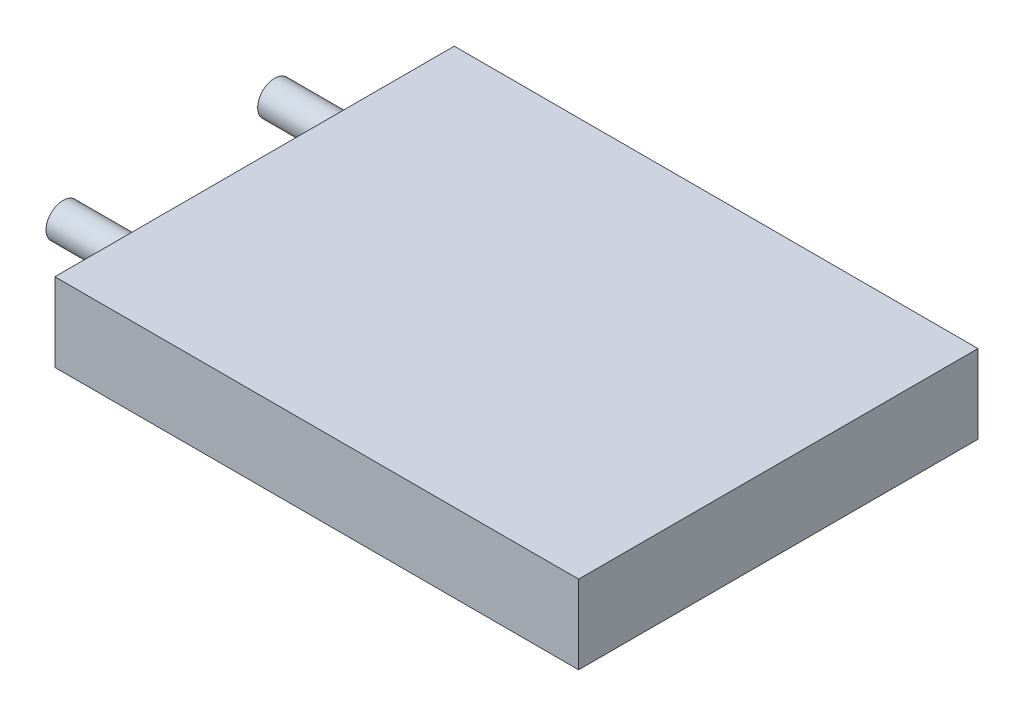
ISO-10303-21;
HEADER;
FILE_DESCRIPTION(('STEP AP214'),'2;1');
FILE_NAME('part.step','',(''),(''),'','','');
FILE_SCHEMA(('AUTOMOTIVE_DESIGN { 1 0 10303 214 1 1 1 1 }'));
ENDSEC;
DATA;
#1=APPLICATION_CONTEXT('core data for automotive mechanical design processes');
#2=APPLICATION_PROTOCOL_DEFINITION('international standard','automotive_design',2000,#1);
#3=PRODUCT_CONTEXT('',#1,'mechanical');
#4=PRODUCT('Part','Part','',(#3));
#5=PRODUCT_RELATED_PRODUCT_CATEGORY('part','',(#4));
#6=PRODUCT_DEFINITION_FORMATION('','',#4);
#7=PRODUCT_DEFINITION_CONTEXT('part definition',#1,'design');
#8=PRODUCT_DEFINITION('design','',#6,#7);
#9=PRODUCT_DEFINITION_SHAPE('','',#8);
#10=(LENGTH_UNIT() NAMED_UNIT(*) SI_UNIT(.MILLI.,.METRE.));
#11=(NAMED_UNIT(*) PLANE_ANGLE_UNIT() SI_UNIT($,.RADIAN.));
#12=(NAMED_UNIT(*) SI_UNIT($,.STERADIAN.) SOLID_ANGLE_UNIT());
#13=UNCERTAINTY_MEASURE_WITH_UNIT(LENGTH_MEASURE(1.E-05),#10,'distance_accuracy_value','');
#14=(GEOMETRIC_REPRESENTATION_CONTEXT(3) GLOBAL_UNCERTAINTY_ASSIGNED_CONTEXT((#13)) GLOBAL_UNIT_ASSIGNED_CONTEXT((#10,
#11,#12)) REPRESENTATION_CONTEXT('',''));
#15=CARTESIAN_POINT('',(0.,0.,0.));
#16=DIRECTION('',(0.,0.,1.));
#17=DIRECTION('',(1.,0.,0.));
#18=AXIS2_PLACEMENT_3D('',#15,#16,#17);
#19=CARTESIAN_POINT('',(40.,12.,-30.5));
#20=DIRECTION('',(-1.,0.,0.));
#21=DIRECTION('',(0.,0.,1.));
#22=AXIS2_PLACEMENT_3D('',#19,#20,#21);
#23=PLANE('',#22);
#24=DIRECTION('',(0.,0.,-1.));
#25=VECTOR('',#24,1.);
#26=CARTESIAN_POINT('',(40.,0.,-30.5));
#27=LINE('',#26,#25);
#28=CARTESIAN_POINT('',(40.,0.,30.5));
#29=VERTEX_POINT('',#28);
#30=CARTESIAN_POINT('',(40.,0.,-30.5));
#31=VERTEX_POINT('',#30);
#32=EDGE_CURVE('E106',#29,#31,#27,.T.);
#33=ORIENTED_EDGE('',*,*,#32,.T.);
#34=DIRECTION('',(0.,-1.,0.));
#35=VECTOR('',#34,1.);
#36=CARTESIAN_POINT('',(40.,12.,-30.5));
#37=LINE('',#36,#35);
#38=CARTESIAN_POINT('',(40.,12.,-30.5));
#39=VERTEX_POINT('',#38);
#40=EDGE_CURVE('E97',#39,#31,#37,.T.);
#41=ORIENTED_EDGE('',*,*,#40,.F.);
#42=DIRECTION('',(0.,0.,-1.));
#43=VECTOR('',#42,1.);
#44=CARTESIAN_POINT('',(40.,12.,-30.5));
#45=LINE('',#44,#43);
#46=CARTESIAN_POINT('',(40.,12.,30.5));
#47=VERTEX_POINT('',#46);
#48=EDGE_CURVE('E91',#47,#39,#45,.T.);
#49=ORIENTED_EDGE('',*,*,#48,.F.);
#50=DIRECTION('',(0.,-1.,0.));
#51=VECTOR('',#50,1.);
#52=CARTESIAN_POINT('',(40.,12.,30.5));
#53=LINE('',#52,#51);
#54=EDGE_CURVE('E102',#47,#29,#53,.T.);
#55=ORIENTED_EDGE('',*,*,#54,.T.);
#56=EDGE_LOOP('',(#33,#41,#49,#55));
#57=FACE_BOUND('',#56,.T.);
#58=ADVANCED_FACE('F39',(#57),#23,.F.);
#59=CARTESIAN_POINT('',(-40.,12.,-30.5));
#60=DIRECTION('',(0.,0.,1.));
#61=DIRECTION('',(1.,0.,0.));
#62=AXIS2_PLACEMENT_3D('',#59,#60,#61);
#63=PLANE('',#62);
#64=DIRECTION('',(-1.,0.,0.));
#65=VECTOR('',#64,1.);
#66=CARTESIAN_POINT('',(-40.,0.,-30.5));
#67=LINE('',#66,#65);
#68=CARTESIAN_POINT('',(-40.,0.,-30.5));
#69=VERTEX_POINT('',#68);
#70=EDGE_CURVE('E96',#31,#69,#67,.T.);
#71=ORIENTED_EDGE('',*,*,#70,.T.);
#72=DIRECTION('',(0.,-1.,0.));
#73=VECTOR('',#72,1.);
#74=CARTESIAN_POINT('',(-40.,12.,-30.5));
#75=LINE('',#74,#73);
#76=CARTESIAN_POINT('',(-40.,12.,-30.5));
#77=VERTEX_POINT('',#76);
#78=EDGE_CURVE('E94',#77,#69,#75,.T.);
#79=ORIENTED_EDGE('',*,*,#78,.F.);
#80=DIRECTION('',(-1.,0.,0.));
#81=VECTOR('',#80,1.);
#82=CARTESIAN_POINT('',(-40.,12.,-30.5));
#83=LINE('',#82,#81);
#84=EDGE_CURVE('E86',#39,#77,#83,.T.);
#85=ORIENTED_EDGE('',*,*,#84,.F.);
#86=ORIENTED_EDGE('',*,*,#40,.T.);
#87=EDGE_LOOP('',(#71,#79,#85,#86));
#88=FACE_BOUND('',#87,.T.);
#89=ADVANCED_FACE('F95',(#88),#63,.F.);
#90=CARTESIAN_POINT('',(-40.,12.,-30.5));
#91=DIRECTION('',(1.,0.,0.));
#92=DIRECTION('',(0.,0.,-1.));
#93=AXIS2_PLACEMENT_3D('',#90,#91,#92);
#94=PLANE('',#93);
#95=CARTESIAN_POINT('',(-40.,6.38490016907919,16.7645406976592));
#96=DIRECTION('',(1.,0.,0.));
#97=DIRECTION('',(0.,0.,-1.));
#98=AXIS2_PLACEMENT_3D('',#95,#96,#97);
#99=CIRCLE('',#98,2.59216136788073);
#100=CARTESIAN_POINT('',(-40.,6.38490016907919,14.1723793297785));
#101=VERTEX_POINT('',#100);
#102=EDGE_CURVE('E11',#101,#101,#99,.F.);
#103=ORIENTED_EDGE('',*,*,#102,.F.);
#104=EDGE_LOOP('',(#103));
#105=FACE_BOUND('',#104,.T.);
#106=CARTESIAN_POINT('',(-40.,6.38490016907919,-15.5670735049693));
#107=DIRECTION('',(1.,0.,0.));
#108=DIRECTION('',(0.,0.,-1.));
#109=AXIS2_PLACEMENT_3D('',#106,#107,#108);
#110=CIRCLE('',#109,2.59216136788073);
#111=CARTESIAN_POINT('',(-40.,6.38490016907919,-18.15923487285));
#112=VERTEX_POINT('',#111);
#113=EDGE_CURVE('E47',#112,#112,#110,.F.);
#114=ORIENTED_EDGE('',*,*,#113,.F.);
#115=EDGE_LOOP('',(#114));
#116=FACE_BOUND('',#115,.T.);
#117=DIRECTION('',(0.,0.,1.));
#118=VECTOR('',#117,1.);
#119=CARTESIAN_POINT('',(-40.,0.,-30.5));
#120=LINE('',#119,#118);
#121=CARTESIAN_POINT('',(-40.,0.,30.5));
#122=VERTEX_POINT('',#121);
#123=EDGE_CURVE('E72',#69,#122,#120,.T.);
#124=ORIENTED_EDGE('',*,*,#123,.T.);
#125=DIRECTION('',(0.,-1.,0.));
#126=VECTOR('',#125,1.);
#127=CARTESIAN_POINT('',(-40.,12.,30.5));
#128=LINE('',#127,#126);
#129=CARTESIAN_POINT('',(-40.,12.,30.5));
#130=VERTEX_POINT('',#129);
#131=EDGE_CURVE('E98',#130,#122,#128,.T.);
#132=ORIENTED_EDGE('',*,*,#131,.F.);
#133=DIRECTION('',(0.,0.,1.));
#134=VECTOR('',#133,1.);
#135=CARTESIAN_POINT('',(-40.,12.,-30.5));
#136=LINE('',#135,#134);
#137=EDGE_CURVE('E89',#77,#130,#136,.T.);
#138=ORIENTED_EDGE('',*,*,#137,.F.);
#139=ORIENTED_EDGE('',*,*,#78,.T.);
#140=EDGE_LOOP('',(#124,#132,#138,#139));
#141=FACE_BOUND('',#140,.T.);
#142=ADVANCED_FACE('F100',(#105,#116,#141),#94,.F.);
#143=CARTESIAN_POINT('',(-40.,12.,30.5));
#144=DIRECTION('',(0.,0.,-1.));
#145=DIRECTION('',(-1.,0.,0.));
#146=AXIS2_PLACEMENT_3D('',#143,#144,#145);
#147=PLANE('',#146);
#148=DIRECTION('',(1.,0.,0.));
#149=VECTOR('',#148,1.);
#150=CARTESIAN_POINT('',(-40.,0.,30.5));
#151=LINE('',#150,#149);
#152=EDGE_CURVE('E78',#122,#29,#151,.T.);
#153=ORIENTED_EDGE('',*,*,#152,.T.);
#154=ORIENTED_EDGE('',*,*,#54,.F.);
#155=DIRECTION('',(1.,0.,0.));
#156=VECTOR('',#155,1.);
#157=CARTESIAN_POINT('',(-40.,12.,30.5));
#158=LINE('',#157,#156);
#159=EDGE_CURVE('E55',#130,#47,#158,.T.);
#160=ORIENTED_EDGE('',*,*,#159,.F.);
#161=ORIENTED_EDGE('',*,*,#131,.T.);
#162=EDGE_LOOP('',(#153,#154,#160,#161));
#163=FACE_BOUND('',#162,.T.);
#164=ADVANCED_FACE('F121',(#163),#147,.F.);
#165=CARTESIAN_POINT('',(0.,12.,0.));
#166=DIRECTION('',(0.,1.,0.));
#167=DIRECTION('',(0.,0.,1.));
#168=AXIS2_PLACEMENT_3D('',#165,#166,#167);
#169=PLANE('',#168);
#170=ORIENTED_EDGE('',*,*,#48,.T.);
#171=ORIENTED_EDGE('',*,*,#84,.T.);
#172=ORIENTED_EDGE('',*,*,#137,.T.);
#173=ORIENTED_EDGE('',*,*,#159,.T.);
#174=EDGE_LOOP('',(#170,#171,#172,#173));
#175=FACE_BOUND('',#174,.T.);
#176=ADVANCED_FACE('F87',(#175),#169,.T.);
#177=CARTESIAN_POINT('',(0.,0.,0.));
#178=DIRECTION('',(0.,1.,0.));
#179=DIRECTION('',(0.,0.,1.));
#180=AXIS2_PLACEMENT_3D('',#177,#178,#179);
#181=PLANE('',#180);
#182=ORIENTED_EDGE('',*,*,#32,.F.);
#183=ORIENTED_EDGE('',*,*,#152,.F.);
#184=ORIENTED_EDGE('',*,*,#123,.F.);
#185=ORIENTED_EDGE('',*,*,#70,.F.);
#186=EDGE_LOOP('',(#182,#183,#184,#185));
#187=FACE_BOUND('',#186,.T.);
#188=ADVANCED_FACE('F138',(#187),#181,.F.);
#189=CARTESIAN_POINT('',(-52.5,6.38490016907919,-15.5670735049693));
#190=DIRECTION('',(1.,0.,0.));
#191=DIRECTION('',(0.,0.,-1.));
#192=AXIS2_PLACEMENT_3D('',#189,#190,#191);
#193=CYLINDRICAL_SURFACE('',#192,2.59216136788073);
#194=CARTESIAN_POINT('',(-52.5,6.38490016907919,-15.5670735049693));
#195=DIRECTION('',(-1.,0.,0.));
#196=DIRECTION('',(0.,0.,1.));
#197=AXIS2_PLACEMENT_3D('',#194,#195,#196);
#198=CIRCLE('',#197,2.59216136788073);
#199=CARTESIAN_POINT('',(-52.5,6.38490016907919,-12.9749121370885));
#200=VERTEX_POINT('',#199);
#201=EDGE_CURVE('E109',#200,#200,#198,.T.);
#202=ORIENTED_EDGE('',*,*,#201,.F.);
#203=EDGE_LOOP('',(#202));
#204=FACE_BOUND('',#203,.T.);
#205=ORIENTED_EDGE('',*,*,#113,.T.);
#206=EDGE_LOOP('',(#205));
#207=FACE_BOUND('',#206,.T.);
#208=ADVANCED_FACE('F118',(#204,#207),#193,.T.);
#209=CARTESIAN_POINT('',(-52.5,6.38490016907919,-15.5670735049693));
#210=DIRECTION('',(-1.,0.,0.));
#211=DIRECTION('',(0.,0.,1.));
#212=AXIS2_PLACEMENT_3D('',#209,#210,#211);
#213=PLANE('',#212);
#214=ORIENTED_EDGE('',*,*,#201,.T.);
#215=EDGE_LOOP('',(#214));
#216=FACE_BOUND('',#215,.T.);
#217=ADVANCED_FACE('F143',(#216),#213,.T.);
#218=CARTESIAN_POINT('',(-52.5,6.38490016907919,16.7645406976592));
#219=DIRECTION('',(1.,0.,0.));
#220=DIRECTION('',(0.,0.,-1.));
#221=AXIS2_PLACEMENT_3D('',#218,#219,#220);
#222=CYLINDRICAL_SURFACE('',#221,2.59216136788073);
#223=CARTESIAN_POINT('',(-52.5,6.38490016907919,16.7645406976592));
#224=DIRECTION('',(-1.,0.,0.));
#225=DIRECTION('',(0.,0.,1.));
#226=AXIS2_PLACEMENT_3D('',#223,#224,#225);
#227=CIRCLE('',#226,2.59216136788073);
#228=CARTESIAN_POINT('',(-52.5,6.38490016907919,19.3567020655399));
#229=VERTEX_POINT('',#228);
#230=EDGE_CURVE('E163',#229,#229,#227,.T.);
#231=ORIENTED_EDGE('',*,*,#230,.F.);
#232=EDGE_LOOP('',(#231));
#233=FACE_BOUND('',#232,.T.);
#234=ORIENTED_EDGE('',*,*,#102,.T.);
#235=EDGE_LOOP('',(#234));
#236=FACE_BOUND('',#235,.T.);
#237=ADVANCED_FACE('F150',(#233,#236),#222,.T.);
#238=CARTESIAN_POINT('',(-52.5,6.38490016907919,16.7645406976592));
#239=DIRECTION('',(-1.,0.,0.));
#240=DIRECTION('',(0.,0.,1.));
#241=AXIS2_PLACEMENT_3D('',#238,#239,#240);
#242=PLANE('',#241);
#243=ORIENTED_EDGE('',*,*,#230,.T.);
#244=EDGE_LOOP('',(#243));
#245=FACE_BOUND('',#244,.T.);
#246=ADVANCED_FACE('F152',(#245),#242,.T.);
#247=CLOSED_SHELL('',(#58,#89,#142,#164,#176,#188,#208,#217,#237,#246));
#248=MANIFOLD_SOLID_BREP('B2',#247);
#249=ADVANCED_BREP_SHAPE_REPRESENTATION('',(#18,#248),#14);
#250=SHAPE_DEFINITION_REPRESENTATION(#9,#249);
ENDSEC;
END-ISO-10303-21;
